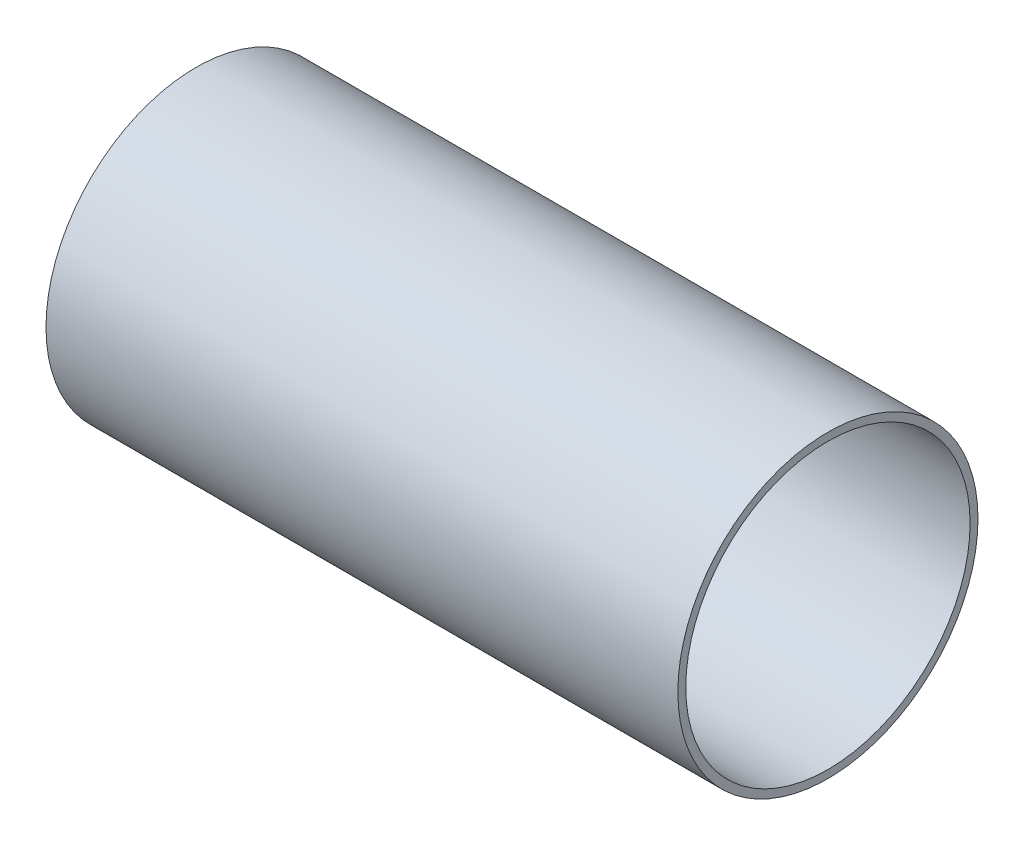
ISO-10303-21;
HEADER;
FILE_DESCRIPTION(('STEP AP214'),'2;1');
FILE_NAME('part.step','',(''),(''),'','','');
FILE_SCHEMA(('AUTOMOTIVE_DESIGN { 1 0 10303 214 1 1 1 1 }'));
ENDSEC;
DATA;
#1=APPLICATION_CONTEXT('core data for automotive mechanical design processes');
#2=APPLICATION_PROTOCOL_DEFINITION('international standard','automotive_design',2000,#1);
#3=PRODUCT_CONTEXT('',#1,'mechanical');
#4=PRODUCT('Part','Part','',(#3));
#5=PRODUCT_RELATED_PRODUCT_CATEGORY('part','',(#4));
#6=PRODUCT_DEFINITION_FORMATION('','',#4);
#7=PRODUCT_DEFINITION_CONTEXT('part definition',#1,'design');
#8=PRODUCT_DEFINITION('design','',#6,#7);
#9=PRODUCT_DEFINITION_SHAPE('','',#8);
#10=(LENGTH_UNIT() NAMED_UNIT(*) SI_UNIT(.MILLI.,.METRE.));
#11=(NAMED_UNIT(*) PLANE_ANGLE_UNIT() SI_UNIT($,.RADIAN.));
#12=(NAMED_UNIT(*) SI_UNIT($,.STERADIAN.) SOLID_ANGLE_UNIT());
#13=UNCERTAINTY_MEASURE_WITH_UNIT(LENGTH_MEASURE(1.E-05),#10,'distance_accuracy_value','');
#14=(GEOMETRIC_REPRESENTATION_CONTEXT(3) GLOBAL_UNCERTAINTY_ASSIGNED_CONTEXT((#13)) GLOBAL_UNIT_ASSIGNED_CONTEXT((#10,
#11,#12)) REPRESENTATION_CONTEXT('',''));
#15=CARTESIAN_POINT('',(0.,0.,0.));
#16=DIRECTION('',(0.,0.,1.));
#17=DIRECTION('',(1.,0.,0.));
#18=AXIS2_PLACEMENT_3D('',#15,#16,#17);
#19=CARTESIAN_POINT('',(254.,0.,0.));
#20=DIRECTION('',(1.,0.,0.));
#21=DIRECTION('',(0.,0.,-1.));
#22=AXIS2_PLACEMENT_3D('',#19,#20,#21);
#23=PLANE('',#22);
#24=CARTESIAN_POINT('',(254.,0.,0.));
#25=DIRECTION('',(1.,0.,0.));
#26=DIRECTION('',(0.,0.,-1.));
#27=AXIS2_PLACEMENT_3D('',#24,#25,#26);
#28=CIRCLE('',#27,60.325);
#29=CARTESIAN_POINT('',(254.,0.,-60.325));
#30=VERTEX_POINT('',#29);
#31=EDGE_CURVE('E10',#30,#30,#28,.T.);
#32=ORIENTED_EDGE('',*,*,#31,.T.);
#33=EDGE_LOOP('',(#32));
#34=FACE_BOUND('',#33,.T.);
#35=CARTESIAN_POINT('',(254.,0.,0.));
#36=DIRECTION('',(1.,0.,0.));
#37=DIRECTION('',(0.,0.,-1.));
#38=AXIS2_PLACEMENT_3D('',#35,#36,#37);
#39=CIRCLE('',#38,57.15);
#40=CARTESIAN_POINT('',(254.,0.,-57.15));
#41=VERTEX_POINT('',#40);
#42=EDGE_CURVE('E50',#41,#41,#39,.T.);
#43=ORIENTED_EDGE('',*,*,#42,.F.);
#44=EDGE_LOOP('',(#43));
#45=FACE_BOUND('',#44,.T.);
#46=ADVANCED_FACE('F37',(#34,#45),#23,.T.);
#47=CARTESIAN_POINT('',(0.,0.,0.));
#48=DIRECTION('',(1.,0.,0.));
#49=DIRECTION('',(0.,0.,-1.));
#50=AXIS2_PLACEMENT_3D('',#47,#48,#49);
#51=PLANE('',#50);
#52=CARTESIAN_POINT('',(0.,0.,0.));
#53=DIRECTION('',(1.,0.,0.));
#54=DIRECTION('',(0.,0.,-1.));
#55=AXIS2_PLACEMENT_3D('',#52,#53,#54);
#56=CIRCLE('',#55,60.325);
#57=CARTESIAN_POINT('',(0.,0.,-60.325));
#58=VERTEX_POINT('',#57);
#59=EDGE_CURVE('E41',#58,#58,#56,.T.);
#60=ORIENTED_EDGE('',*,*,#59,.F.);
#61=EDGE_LOOP('',(#60));
#62=FACE_BOUND('',#61,.T.);
#63=CARTESIAN_POINT('',(0.,0.,0.));
#64=DIRECTION('',(1.,0.,0.));
#65=DIRECTION('',(0.,0.,-1.));
#66=AXIS2_PLACEMENT_3D('',#63,#64,#65);
#67=CIRCLE('',#66,57.15);
#68=CARTESIAN_POINT('',(0.,0.,-57.15));
#69=VERTEX_POINT('',#68);
#70=EDGE_CURVE('E52',#69,#69,#67,.T.);
#71=ORIENTED_EDGE('',*,*,#70,.T.);
#72=EDGE_LOOP('',(#71));
#73=FACE_BOUND('',#72,.T.);
#74=ADVANCED_FACE('F64',(#62,#73),#51,.F.);
#75=CARTESIAN_POINT('',(254.,0.,0.));
#76=DIRECTION('',(-1.,0.,0.));
#77=DIRECTION('',(0.,0.,1.));
#78=AXIS2_PLACEMENT_3D('',#75,#76,#77);
#79=CYLINDRICAL_SURFACE('',#78,60.325);
#80=ORIENTED_EDGE('',*,*,#31,.F.);
#81=EDGE_LOOP('',(#80));
#82=FACE_BOUND('',#81,.T.);
#83=ORIENTED_EDGE('',*,*,#59,.T.);
#84=EDGE_LOOP('',(#83));
#85=FACE_BOUND('',#84,.T.);
#86=ADVANCED_FACE('F39',(#82,#85),#79,.T.);
#87=CARTESIAN_POINT('',(254.,0.,0.));
#88=DIRECTION('',(-1.,0.,0.));
#89=DIRECTION('',(0.,0.,1.));
#90=AXIS2_PLACEMENT_3D('',#87,#88,#89);
#91=CYLINDRICAL_SURFACE('',#90,57.15);
#92=ORIENTED_EDGE('',*,*,#42,.T.);
#93=EDGE_LOOP('',(#92));
#94=FACE_BOUND('',#93,.T.);
#95=ORIENTED_EDGE('',*,*,#70,.F.);
#96=EDGE_LOOP('',(#95));
#97=FACE_BOUND('',#96,.T.);
#98=ADVANCED_FACE('F60',(#94,#97),#91,.F.);
#99=CLOSED_SHELL('',(#46,#74,#86,#98));
#100=MANIFOLD_SOLID_BREP('B2',#99);
#101=ADVANCED_BREP_SHAPE_REPRESENTATION('',(#18,#100),#14);
#102=SHAPE_DEFINITION_REPRESENTATION(#9,#101);
ENDSEC;
END-ISO-10303-21;
